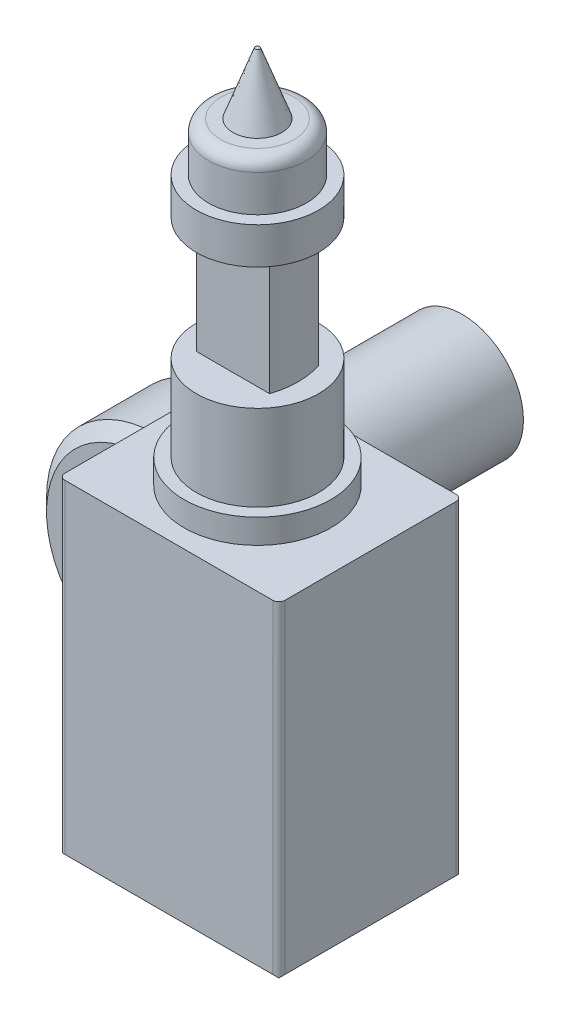
ISO-10303-21;
HEADER;
FILE_DESCRIPTION(('STEP AP214'),'2;1');
FILE_NAME('part.step','',(''),(''),'','','');
FILE_SCHEMA(('AUTOMOTIVE_DESIGN { 1 0 10303 214 1 1 1 1 }'));
ENDSEC;
DATA;
#1=APPLICATION_CONTEXT('core data for automotive mechanical design processes');
#2=APPLICATION_PROTOCOL_DEFINITION('international standard','automotive_design',2000,#1);
#3=PRODUCT_CONTEXT('',#1,'mechanical');
#4=PRODUCT('Part','Part','',(#3));
#5=PRODUCT_RELATED_PRODUCT_CATEGORY('part','',(#4));
#6=PRODUCT_DEFINITION_FORMATION('','',#4);
#7=PRODUCT_DEFINITION_CONTEXT('part definition',#1,'design');
#8=PRODUCT_DEFINITION('design','',#6,#7);
#9=PRODUCT_DEFINITION_SHAPE('','',#8);
#10=(LENGTH_UNIT() NAMED_UNIT(*) SI_UNIT(.MILLI.,.METRE.));
#11=(NAMED_UNIT(*) PLANE_ANGLE_UNIT() SI_UNIT($,.RADIAN.));
#12=(NAMED_UNIT(*) SI_UNIT($,.STERADIAN.) SOLID_ANGLE_UNIT());
#13=UNCERTAINTY_MEASURE_WITH_UNIT(LENGTH_MEASURE(1.E-05),#10,'distance_accuracy_value','');
#14=(GEOMETRIC_REPRESENTATION_CONTEXT(3) GLOBAL_UNCERTAINTY_ASSIGNED_CONTEXT((#13)) GLOBAL_UNIT_ASSIGNED_CONTEXT((#10,
#11,#12)) REPRESENTATION_CONTEXT('',''));
#15=CARTESIAN_POINT('',(0.,0.,0.));
#16=DIRECTION('',(0.,0.,1.));
#17=DIRECTION('',(1.,0.,0.));
#18=AXIS2_PLACEMENT_3D('',#15,#16,#17);
#19=CARTESIAN_POINT('',(1.4210854715202E-13,1.95399252334028E-13,-90.));
#20=DIRECTION('',(0.,0.,1.));
#21=DIRECTION('',(0.,-1.,0.));
#22=AXIS2_PLACEMENT_3D('',#19,#20,#21);
#23=PLANE('',#22);
#24=CARTESIAN_POINT('',(1.4210854715202E-13,1.95399252334028E-13,-90.));
#25=DIRECTION('',(0.,0.,-1.));
#26=DIRECTION('',(-1.,0.,0.));
#27=AXIS2_PLACEMENT_3D('',#24,#25,#26);
#28=CIRCLE('',#27,50.);
#29=CARTESIAN_POINT('',(50.,1.95399252334028E-13,-90.));
#30=VERTEX_POINT('',#29);
#31=EDGE_CURVE('E24',#30,#30,#28,.T.);
#32=ORIENTED_EDGE('',*,*,#31,.T.);
#33=EDGE_LOOP('',(#32));
#34=FACE_BOUND('',#33,.T.);
#35=ADVANCED_FACE('F15',(#34),#23,.F.);
#36=CARTESIAN_POINT('',(1.4210854715202E-13,2.1316282072803E-13,90.));
#37=DIRECTION('',(0.,0.,-1.));
#38=DIRECTION('',(-1.,0.,0.));
#39=AXIS2_PLACEMENT_3D('',#36,#37,#38);
#40=CYLINDRICAL_SURFACE('',#39,50.);
#41=ORIENTED_EDGE('',*,*,#31,.F.);
#42=DIRECTION('',(0.,0.,1.));
#43=VECTOR('',#42,1.);
#44=CARTESIAN_POINT('',(50.,2.05304863256316E-13,90.));
#45=LINE('',#44,#43);
#46=CARTESIAN_POINT('',(50.,1.95399252334028E-13,90.));
#47=VERTEX_POINT('',#46);
#48=EDGE_CURVE('E10',#30,#47,#45,.T.);
#49=ORIENTED_EDGE('',*,*,#48,.T.);
#50=CARTESIAN_POINT('',(1.4210854715202E-13,2.1316282072803E-13,90.));
#51=DIRECTION('',(0.,0.,1.));
#52=DIRECTION('',(-1.,0.,0.));
#53=AXIS2_PLACEMENT_3D('',#50,#51,#52);
#54=CIRCLE('',#53,50.);
#55=EDGE_CURVE('E383',#47,#47,#54,.T.);
#56=ORIENTED_EDGE('',*,*,#55,.F.);
#57=ORIENTED_EDGE('',*,*,#48,.F.);
#58=EDGE_LOOP('',(#41,#49,#56,#57));
#59=FACE_BOUND('',#58,.T.);
#60=ADVANCED_FACE('F562',(#59),#40,.T.);
#61=CARTESIAN_POINT('',(1.4210854715202E-13,2.1316282072803E-13,90.));
#62=DIRECTION('',(0.,0.,1.));
#63=DIRECTION('',(-1.,0.,0.));
#64=AXIS2_PLACEMENT_3D('',#61,#62,#63);
#65=CYLINDRICAL_SURFACE('',#64,90.);
#66=DIRECTION('',(0.,0.,1.));
#67=VECTOR('',#66,1.);
#68=CARTESIAN_POINT('',(1.4210854715202E-13,-90.,90.));
#69=LINE('',#68,#67);
#70=CARTESIAN_POINT('',(1.4210854715202E-13,-90.,100.));
#71=VERTEX_POINT('',#70);
#72=CARTESIAN_POINT('',(1.4210854715202E-13,-90.,160.));
#73=VERTEX_POINT('',#72);
#74=EDGE_CURVE('E390',#71,#73,#69,.T.);
#75=ORIENTED_EDGE('',*,*,#74,.T.);
#76=CARTESIAN_POINT('',(1.4210854715202E-13,2.1316282072803E-13,160.));
#77=DIRECTION('',(0.,0.,1.));
#78=DIRECTION('',(-1.,0.,0.));
#79=AXIS2_PLACEMENT_3D('',#76,#77,#78);
#80=CIRCLE('',#79,90.);
#81=CARTESIAN_POINT('',(1.4210854715202E-13,90.,160.));
#82=VERTEX_POINT('',#81);
#83=EDGE_CURVE('E315',#82,#73,#80,.T.);
#84=ORIENTED_EDGE('',*,*,#83,.F.);
#85=DIRECTION('',(0.,0.,-1.));
#86=VECTOR('',#85,1.);
#87=CARTESIAN_POINT('',(1.4210854715202E-13,90.,90.));
#88=LINE('',#87,#86);
#89=CARTESIAN_POINT('',(1.4210854715202E-13,90.,100.));
#90=VERTEX_POINT('',#89);
#91=EDGE_CURVE('E305',#82,#90,#88,.T.);
#92=ORIENTED_EDGE('',*,*,#91,.T.);
#93=CARTESIAN_POINT('',(1.4210854715202E-13,1.95399252334028E-13,100.));
#94=DIRECTION('',(0.,0.,-1.));
#95=DIRECTION('',(-1.,0.,0.));
#96=AXIS2_PLACEMENT_3D('',#93,#94,#95);
#97=CIRCLE('',#96,90.);
#98=EDGE_CURVE('E48',#71,#90,#97,.T.);
#99=ORIENTED_EDGE('',*,*,#98,.F.);
#100=EDGE_LOOP('',(#75,#84,#92,#99));
#101=FACE_BOUND('',#100,.T.);
#102=ADVANCED_FACE('F518',(#101),#65,.T.);
#103=CARTESIAN_POINT('',(1.4210854715202E-13,2.1316282072803E-13,95.));
#104=DIRECTION('',(0.,0.,1.));
#105=DIRECTION('',(-1.,0.,0.));
#106=AXIS2_PLACEMENT_3D('',#103,#104,#105);
#107=CONICAL_SURFACE('',#106,85.,0.785398163397448);
#108=DIRECTION('',(0.,-0.707106781186548,0.707106781186548));
#109=VECTOR('',#108,1.);
#110=CARTESIAN_POINT('',(1.4210854715202E-13,-85.,95.));
#111=LINE('',#110,#109);
#112=CARTESIAN_POINT('',(1.4210854715202E-13,-80.,90.));
#113=VERTEX_POINT('',#112);
#114=EDGE_CURVE('E347',#113,#71,#111,.T.);
#115=ORIENTED_EDGE('',*,*,#114,.T.);
#116=ORIENTED_EDGE('',*,*,#98,.T.);
#117=DIRECTION('',(0.,-0.707106781186548,-0.707106781186548));
#118=VECTOR('',#117,1.);
#119=CARTESIAN_POINT('',(1.4210854715202E-13,85.,95.));
#120=LINE('',#119,#118);
#121=CARTESIAN_POINT('',(1.4210854715202E-13,80.,90.));
#122=VERTEX_POINT('',#121);
#123=EDGE_CURVE('E309',#90,#122,#120,.T.);
#124=ORIENTED_EDGE('',*,*,#123,.T.);
#125=CARTESIAN_POINT('',(1.4210854715202E-13,2.1316282072803E-13,90.));
#126=DIRECTION('',(0.,0.,1.));
#127=DIRECTION('',(-1.,0.,0.));
#128=AXIS2_PLACEMENT_3D('',#125,#126,#127);
#129=CIRCLE('',#128,80.);
#130=EDGE_CURVE('E353',#122,#113,#129,.T.);
#131=ORIENTED_EDGE('',*,*,#130,.T.);
#132=EDGE_LOOP('',(#115,#116,#124,#131));
#133=FACE_BOUND('',#132,.T.);
#134=ADVANCED_FACE('F582',(#133),#107,.T.);
#135=CARTESIAN_POINT('',(1.4210854715202E-13,2.1316282072803E-13,165.));
#136=DIRECTION('',(0.,0.,-1.));
#137=DIRECTION('',(-1.,0.,0.));
#138=AXIS2_PLACEMENT_3D('',#135,#136,#137);
#139=CONICAL_SURFACE('',#138,85.,0.785398163397448);
#140=DIRECTION('',(0.,0.707106781186548,0.707106781186548));
#141=VECTOR('',#140,1.);
#142=CARTESIAN_POINT('',(1.4210854715202E-13,-85.,165.));
#143=LINE('',#142,#141);
#144=CARTESIAN_POINT('',(1.4210854715202E-13,-80.,170.));
#145=VERTEX_POINT('',#144);
#146=EDGE_CURVE('E400',#73,#145,#143,.T.);
#147=ORIENTED_EDGE('',*,*,#146,.T.);
#148=CARTESIAN_POINT('',(1.4210854715202E-13,2.1316282072803E-13,170.));
#149=DIRECTION('',(0.,0.,-1.));
#150=DIRECTION('',(-1.,0.,0.));
#151=AXIS2_PLACEMENT_3D('',#148,#149,#150);
#152=CIRCLE('',#151,80.);
#153=CARTESIAN_POINT('',(1.4210854715202E-13,80.,170.));
#154=VERTEX_POINT('',#153);
#155=EDGE_CURVE('E345',#145,#154,#152,.T.);
#156=ORIENTED_EDGE('',*,*,#155,.T.);
#157=DIRECTION('',(0.,0.707106781186548,-0.707106781186548));
#158=VECTOR('',#157,1.);
#159=CARTESIAN_POINT('',(1.4210854715202E-13,85.,165.));
#160=LINE('',#159,#158);
#161=EDGE_CURVE('E308',#154,#82,#160,.T.);
#162=ORIENTED_EDGE('',*,*,#161,.T.);
#163=ORIENTED_EDGE('',*,*,#83,.T.);
#164=EDGE_LOOP('',(#147,#156,#162,#163));
#165=FACE_BOUND('',#164,.T.);
#166=ADVANCED_FACE('F515',(#165),#139,.T.);
#167=CARTESIAN_POINT('',(1.4210854715202E-13,2.1316282072803E-13,170.));
#168=DIRECTION('',(0.,0.,1.));
#169=DIRECTION('',(0.,-1.,0.));
#170=AXIS2_PLACEMENT_3D('',#167,#168,#169);
#171=PLANE('',#170);
#172=DIRECTION('',(0.,1.,0.));
#173=VECTOR('',#172,1.);
#174=CARTESIAN_POINT('',(1.4210854715202E-13,50.,170.));
#175=LINE('',#174,#173);
#176=EDGE_CURVE('E465',#145,#154,#175,.T.);
#177=ORIENTED_EDGE('',*,*,#176,.T.);
#178=ORIENTED_EDGE('',*,*,#155,.F.);
#179=EDGE_LOOP('',(#177,#178));
#180=FACE_BOUND('',#179,.T.);
#181=ADVANCED_FACE('F507',(#180),#171,.T.);
#182=CARTESIAN_POINT('',(180.,100.,90.));
#183=DIRECTION('',(0.,1.,0.));
#184=DIRECTION('',(0.,0.,-1.));
#185=AXIS2_PLACEMENT_3D('',#182,#183,#184);
#186=PLANE('',#185);
#187=CARTESIAN_POINT('',(87.5,100.,165.));
#188=DIRECTION('',(0.,-1.,0.));
#189=DIRECTION('',(0.,0.,1.));
#190=AXIS2_PLACEMENT_3D('',#187,#188,#189);
#191=CIRCLE('',#190,60.);
#192=CARTESIAN_POINT('',(87.5,100.,105.));
#193=VERTEX_POINT('',#192);
#194=EDGE_CURVE('E284',#193,#193,#191,.T.);
#195=ORIENTED_EDGE('',*,*,#194,.T.);
#196=EDGE_LOOP('',(#195));
#197=FACE_BOUND('',#196,.T.);
#198=CARTESIAN_POINT('',(175.,100.,95.));
#199=DIRECTION('',(0.,-1.,0.));
#200=DIRECTION('',(0.707106781186548,0.,-0.707106781186548));
#201=AXIS2_PLACEMENT_3D('',#198,#199,#200);
#202=CIRCLE('',#201,5.);
#203=CARTESIAN_POINT('',(175.,100.,90.));
#204=VERTEX_POINT('',#203);
#205=CARTESIAN_POINT('',(180.,100.,95.));
#206=VERTEX_POINT('',#205);
#207=EDGE_CURVE('E271',#204,#206,#202,.T.);
#208=ORIENTED_EDGE('',*,*,#207,.F.);
#209=DIRECTION('',(-1.,0.,0.));
#210=VECTOR('',#209,1.);
#211=CARTESIAN_POINT('',(180.,100.,90.));
#212=LINE('',#211,#210);
#213=CARTESIAN_POINT('',(1.4210854715202E-13,100.,90.));
#214=VERTEX_POINT('',#213);
#215=EDGE_CURVE('E379',#204,#214,#212,.T.);
#216=ORIENTED_EDGE('',*,*,#215,.T.);
#217=DIRECTION('',(0.,0.,1.));
#218=VECTOR('',#217,1.);
#219=CARTESIAN_POINT('',(1.4210854715202E-13,100.,90.));
#220=LINE('',#219,#218);
#221=CARTESIAN_POINT('',(1.4210854715202E-13,100.,235.));
#222=VERTEX_POINT('',#221);
#223=EDGE_CURVE('E387',#214,#222,#220,.T.);
#224=ORIENTED_EDGE('',*,*,#223,.T.);
#225=CARTESIAN_POINT('',(5.00000000000014,100.,235.));
#226=DIRECTION('',(0.,-1.,0.));
#227=DIRECTION('',(-0.707106781186548,0.,0.707106781186548));
#228=AXIS2_PLACEMENT_3D('',#225,#226,#227);
#229=CIRCLE('',#228,5.);
#230=CARTESIAN_POINT('',(5.00000000000014,100.,240.));
#231=VERTEX_POINT('',#230);
#232=EDGE_CURVE('E455',#231,#222,#229,.T.);
#233=ORIENTED_EDGE('',*,*,#232,.F.);
#234=DIRECTION('',(-1.,0.,0.));
#235=VECTOR('',#234,1.);
#236=CARTESIAN_POINT('',(180.,100.,240.));
#237=LINE('',#236,#235);
#238=CARTESIAN_POINT('',(175.,100.,240.));
#239=VERTEX_POINT('',#238);
#240=EDGE_CURVE('E415',#239,#231,#237,.T.);
#241=ORIENTED_EDGE('',*,*,#240,.F.);
#242=CARTESIAN_POINT('',(175.,100.,235.));
#243=DIRECTION('',(0.,-1.,0.));
#244=DIRECTION('',(0.707106781186548,0.,0.707106781186548));
#245=AXIS2_PLACEMENT_3D('',#242,#243,#244);
#246=CIRCLE('',#245,5.);
#247=CARTESIAN_POINT('',(180.,100.,235.));
#248=VERTEX_POINT('',#247);
#249=EDGE_CURVE('E358',#248,#239,#246,.T.);
#250=ORIENTED_EDGE('',*,*,#249,.F.);
#251=DIRECTION('',(0.,0.,1.));
#252=VECTOR('',#251,1.);
#253=CARTESIAN_POINT('',(180.,100.,90.));
#254=LINE('',#253,#252);
#255=EDGE_CURVE('E384',#206,#248,#254,.T.);
#256=ORIENTED_EDGE('',*,*,#255,.F.);
#257=EDGE_LOOP('',(#208,#216,#224,#233,#241,#250,#256));
#258=FACE_BOUND('',#257,.T.);
#259=ADVANCED_FACE('F629',(#197,#258),#186,.T.);
#260=CARTESIAN_POINT('',(1.4210854715202E-13,100.,90.));
#261=DIRECTION('',(-1.,0.,0.));
#262=DIRECTION('',(0.,0.,1.));
#263=AXIS2_PLACEMENT_3D('',#260,#261,#262);
#264=PLANE('',#263);
#265=DIRECTION('',(0.,-1.,0.));
#266=VECTOR('',#265,1.);
#267=CARTESIAN_POINT('',(1.4210854715202E-13,30.,235.));
#268=LINE('',#267,#266);
#269=CARTESIAN_POINT('',(1.4210854715202E-13,-165.,235.));
#270=VERTEX_POINT('',#269);
#271=EDGE_CURVE('E471',#222,#270,#268,.T.);
#272=ORIENTED_EDGE('',*,*,#271,.F.);
#273=ORIENTED_EDGE('',*,*,#223,.F.);
#274=DIRECTION('',(0.,1.,0.));
#275=VECTOR('',#274,1.);
#276=CARTESIAN_POINT('',(1.4210854715202E-13,-180.,90.));
#277=LINE('',#276,#275);
#278=EDGE_CURVE('E357',#122,#214,#277,.T.);
#279=ORIENTED_EDGE('',*,*,#278,.F.);
#280=ORIENTED_EDGE('',*,*,#123,.F.);
#281=ORIENTED_EDGE('',*,*,#91,.F.);
#282=ORIENTED_EDGE('',*,*,#161,.F.);
#283=ORIENTED_EDGE('',*,*,#176,.F.);
#284=ORIENTED_EDGE('',*,*,#146,.F.);
#285=ORIENTED_EDGE('',*,*,#74,.F.);
#286=ORIENTED_EDGE('',*,*,#114,.F.);
#287=DIRECTION('',(0.,1.,0.));
#288=VECTOR('',#287,1.);
#289=CARTESIAN_POINT('',(1.4210854715202E-13,-180.,90.));
#290=LINE('',#289,#288);
#291=CARTESIAN_POINT('',(1.4210854715202E-13,-165.,90.));
#292=VERTEX_POINT('',#291);
#293=EDGE_CURVE('E344',#292,#113,#290,.T.);
#294=ORIENTED_EDGE('',*,*,#293,.F.);
#295=DIRECTION('',(0.,0.,-1.));
#296=VECTOR('',#295,1.);
#297=CARTESIAN_POINT('',(1.4210854715202E-13,-165.,90.));
#298=LINE('',#297,#296);
#299=EDGE_CURVE('E322',#270,#292,#298,.T.);
#300=ORIENTED_EDGE('',*,*,#299,.F.);
#301=EDGE_LOOP('',(#272,#273,#279,#280,#281,#282,#283,#284,#285,#286,#294,#300));
#302=FACE_BOUND('',#301,.T.);
#303=ADVANCED_FACE('F512',(#302),#264,.T.);
#304=CARTESIAN_POINT('',(1.4210854715202E-13,-180.,90.));
#305=DIRECTION('',(0.,-1.,0.));
#306=DIRECTION('',(-1.,0.,0.));
#307=AXIS2_PLACEMENT_3D('',#304,#305,#306);
#308=PLANE('',#307);
#309=DIRECTION('',(0.,0.,-1.));
#310=VECTOR('',#309,1.);
#311=CARTESIAN_POINT('',(165.,-180.,90.));
#312=LINE('',#311,#310);
#313=CARTESIAN_POINT('',(165.,-180.,225.));
#314=VERTEX_POINT('',#313);
#315=CARTESIAN_POINT('',(165.,-180.,105.));
#316=VERTEX_POINT('',#315);
#317=EDGE_CURVE('E361',#314,#316,#312,.T.);
#318=ORIENTED_EDGE('',*,*,#317,.F.);
#319=DIRECTION('',(1.,0.,0.));
#320=VECTOR('',#319,1.);
#321=CARTESIAN_POINT('',(45.,-180.,225.));
#322=LINE('',#321,#320);
#323=CARTESIAN_POINT('',(15.,-180.,225.));
#324=VERTEX_POINT('',#323);
#325=EDGE_CURVE('E367',#324,#314,#322,.T.);
#326=ORIENTED_EDGE('',*,*,#325,.F.);
#327=DIRECTION('',(0.,0.,1.));
#328=VECTOR('',#327,1.);
#329=CARTESIAN_POINT('',(15.,-180.,90.));
#330=LINE('',#329,#328);
#331=CARTESIAN_POINT('',(15.,-180.,105.));
#332=VERTEX_POINT('',#331);
#333=EDGE_CURVE('E325',#332,#324,#330,.T.);
#334=ORIENTED_EDGE('',*,*,#333,.F.);
#335=DIRECTION('',(-1.,0.,0.));
#336=VECTOR('',#335,1.);
#337=CARTESIAN_POINT('',(1.4210854715202E-13,-180.,105.));
#338=LINE('',#337,#336);
#339=EDGE_CURVE('E18',#316,#332,#338,.T.);
#340=ORIENTED_EDGE('',*,*,#339,.F.);
#341=EDGE_LOOP('',(#318,#326,#334,#340));
#342=FACE_BOUND('',#341,.T.);
#343=ADVANCED_FACE('F621',(#342),#308,.T.);
#344=CARTESIAN_POINT('',(180.,-180.,90.));
#345=DIRECTION('',(1.,0.,0.));
#346=DIRECTION('',(0.,-1.,0.));
#347=AXIS2_PLACEMENT_3D('',#344,#345,#346);
#348=PLANE('',#347);
#349=DIRECTION('',(0.,-1.,0.));
#350=VECTOR('',#349,1.);
#351=CARTESIAN_POINT('',(180.,-90.,95.));
#352=LINE('',#351,#350);
#353=CARTESIAN_POINT('',(180.,-165.,95.));
#354=VERTEX_POINT('',#353);
#355=EDGE_CURVE('E246',#206,#354,#352,.T.);
#356=ORIENTED_EDGE('',*,*,#355,.F.);
#357=ORIENTED_EDGE('',*,*,#255,.T.);
#358=DIRECTION('',(0.,1.,0.));
#359=VECTOR('',#358,1.);
#360=CARTESIAN_POINT('',(180.,-110.,235.));
#361=LINE('',#360,#359);
#362=CARTESIAN_POINT('',(180.,-165.,235.));
#363=VERTEX_POINT('',#362);
#364=EDGE_CURVE('E249',#363,#248,#361,.T.);
#365=ORIENTED_EDGE('',*,*,#364,.F.);
#366=DIRECTION('',(0.,0.,1.));
#367=VECTOR('',#366,1.);
#368=CARTESIAN_POINT('',(180.,-165.,90.));
#369=LINE('',#368,#367);
#370=EDGE_CURVE('E242',#354,#363,#369,.T.);
#371=ORIENTED_EDGE('',*,*,#370,.F.);
#372=EDGE_LOOP('',(#356,#357,#365,#371));
#373=FACE_BOUND('',#372,.T.);
#374=ADVANCED_FACE('F244',(#373),#348,.T.);
#375=CARTESIAN_POINT('',(7.50000000000014,-172.5,90.));
#376=DIRECTION('',(-0.707106781186548,-0.707106781186548,0.));
#377=DIRECTION('',(-0.707106781186548,0.707106781186548,0.));
#378=AXIS2_PLACEMENT_3D('',#375,#376,#377);
#379=PLANE('',#378);
#380=CARTESIAN_POINT('',(5.00000000000014,-170.,235.));
#381=DIRECTION('',(0.707106781186548,0.707106781186548,0.));
#382=DIRECTION('',(-0.707106781186548,0.707106781186548,0.));
#383=AXIS2_PLACEMENT_3D('',#380,#381,#382);
#384=ELLIPSE('',#383,7.07106781186548,5.);
#385=CARTESIAN_POINT('',(1.46446609406738,-166.464466094067,238.535533905933));
#386=VERTEX_POINT('',#385);
#387=EDGE_CURVE('E326',#270,#386,#384,.T.);
#388=ORIENTED_EDGE('',*,*,#387,.F.);
#389=ORIENTED_EDGE('',*,*,#299,.T.);
#390=DIRECTION('',(-0.577350269189626,0.577350269189626,-0.577350269189626));
#391=VECTOR('',#390,1.);
#392=CARTESIAN_POINT('',(15.,-180.,105.));
#393=LINE('',#392,#391);
#394=EDGE_CURVE('E255',#332,#292,#393,.T.);
#395=ORIENTED_EDGE('',*,*,#394,.F.);
#396=ORIENTED_EDGE('',*,*,#333,.T.);
#397=DIRECTION('',(-0.577350269189626,0.577350269189626,0.577350269189626));
#398=VECTOR('',#397,1.);
#399=CARTESIAN_POINT('',(15.,-180.,225.));
#400=LINE('',#399,#398);
#401=EDGE_CURVE('E363',#324,#386,#400,.T.);
#402=ORIENTED_EDGE('',*,*,#401,.T.);
#403=EDGE_LOOP('',(#388,#389,#395,#396,#402));
#404=FACE_BOUND('',#403,.T.);
#405=ADVANCED_FACE('F620',(#404),#379,.T.);
#406=CARTESIAN_POINT('',(5.00000000000014,30.,235.));
#407=DIRECTION('',(0.,-1.,0.));
#408=DIRECTION('',(-0.707106781186548,0.,0.707106781186548));
#409=AXIS2_PLACEMENT_3D('',#406,#407,#408);
#410=CYLINDRICAL_SURFACE('',#409,5.);
#411=CARTESIAN_POINT('',(5.00000000000014,-170.,235.));
#412=DIRECTION('',(0.,0.707106781186547,-0.707106781186548));
#413=DIRECTION('',(0.,0.707106781186548,0.707106781186547));
#414=AXIS2_PLACEMENT_3D('',#411,#412,#413);
#415=ELLIPSE('',#414,7.07106781186547,5.);
#416=CARTESIAN_POINT('',(5.00000000000014,-165.,240.));
#417=VERTEX_POINT('',#416);
#418=EDGE_CURVE('E368',#386,#417,#415,.T.);
#419=ORIENTED_EDGE('',*,*,#418,.T.);
#420=DIRECTION('',(0.,1.,0.));
#421=VECTOR('',#420,1.);
#422=CARTESIAN_POINT('',(5.00000000000014,30.,240.));
#423=LINE('',#422,#421);
#424=EDGE_CURVE('E447',#417,#231,#423,.T.);
#425=ORIENTED_EDGE('',*,*,#424,.T.);
#426=ORIENTED_EDGE('',*,*,#232,.T.);
#427=ORIENTED_EDGE('',*,*,#271,.T.);
#428=ORIENTED_EDGE('',*,*,#387,.T.);
#429=EDGE_LOOP('',(#419,#425,#426,#427,#428));
#430=FACE_BOUND('',#429,.T.);
#431=ADVANCED_FACE('F624',(#430),#410,.T.);
#432=CARTESIAN_POINT('',(90.,-40.,240.));
#433=DIRECTION('',(0.,0.,1.));
#434=DIRECTION('',(0.,-1.,0.));
#435=AXIS2_PLACEMENT_3D('',#432,#433,#434);
#436=PLANE('',#435);
#437=DIRECTION('',(0.,-1.,0.));
#438=VECTOR('',#437,1.);
#439=CARTESIAN_POINT('',(175.,-110.,240.));
#440=LINE('',#439,#438);
#441=CARTESIAN_POINT('',(175.,-165.,240.));
#442=VERTEX_POINT('',#441);
#443=EDGE_CURVE('E352',#239,#442,#440,.T.);
#444=ORIENTED_EDGE('',*,*,#443,.F.);
#445=ORIENTED_EDGE('',*,*,#240,.T.);
#446=ORIENTED_EDGE('',*,*,#424,.F.);
#447=DIRECTION('',(-1.,0.,0.));
#448=VECTOR('',#447,1.);
#449=CARTESIAN_POINT('',(45.,-165.,240.));
#450=LINE('',#449,#448);
#451=EDGE_CURVE('E297',#442,#417,#450,.T.);
#452=ORIENTED_EDGE('',*,*,#451,.F.);
#453=EDGE_LOOP('',(#444,#445,#446,#452));
#454=FACE_BOUND('',#453,.T.);
#455=ADVANCED_FACE('F611',(#454),#436,.T.);
#456=CARTESIAN_POINT('',(45.,-172.5,232.5));
#457=DIRECTION('',(0.,-0.707106781186548,0.707106781186548));
#458=DIRECTION('',(-1.,0.,0.));
#459=AXIS2_PLACEMENT_3D('',#456,#457,#458);
#460=PLANE('',#459);
#461=CARTESIAN_POINT('',(175.,-170.,235.));
#462=DIRECTION('',(0.,0.707106781186547,-0.707106781186548));
#463=DIRECTION('',(0.,0.707106781186548,0.707106781186547));
#464=AXIS2_PLACEMENT_3D('',#461,#462,#463);
#465=ELLIPSE('',#464,7.07106781186547,5.);
#466=CARTESIAN_POINT('',(178.535533905933,-166.464466094067,238.535533905933));
#467=VERTEX_POINT('',#466);
#468=EDGE_CURVE('E298',#442,#467,#465,.T.);
#469=ORIENTED_EDGE('',*,*,#468,.F.);
#470=ORIENTED_EDGE('',*,*,#451,.T.);
#471=ORIENTED_EDGE('',*,*,#418,.F.);
#472=ORIENTED_EDGE('',*,*,#401,.F.);
#473=ORIENTED_EDGE('',*,*,#325,.T.);
#474=DIRECTION('',(-0.577350269189626,-0.577350269189626,-0.577350269189626));
#475=VECTOR('',#474,1.);
#476=CARTESIAN_POINT('',(180.,-165.,240.));
#477=LINE('',#476,#475);
#478=EDGE_CURVE('E477',#467,#314,#477,.T.);
#479=ORIENTED_EDGE('',*,*,#478,.F.);
#480=EDGE_LOOP('',(#469,#470,#471,#472,#473,#479));
#481=FACE_BOUND('',#480,.T.);
#482=ADVANCED_FACE('F607',(#481),#460,.T.);
#483=CARTESIAN_POINT('',(175.,-110.,235.));
#484=DIRECTION('',(0.,1.,0.));
#485=DIRECTION('',(0.707106781186548,0.,0.707106781186548));
#486=AXIS2_PLACEMENT_3D('',#483,#484,#485);
#487=CYLINDRICAL_SURFACE('',#486,5.);
#488=ORIENTED_EDGE('',*,*,#249,.T.);
#489=ORIENTED_EDGE('',*,*,#443,.T.);
#490=ORIENTED_EDGE('',*,*,#468,.T.);
#491=CARTESIAN_POINT('',(175.,-170.,235.));
#492=DIRECTION('',(-0.707106781186548,0.707106781186548,0.));
#493=DIRECTION('',(0.707106781186548,0.707106781186548,0.));
#494=AXIS2_PLACEMENT_3D('',#491,#492,#493);
#495=ELLIPSE('',#494,7.07106781186548,5.);
#496=EDGE_CURVE('E254',#467,#363,#495,.T.);
#497=ORIENTED_EDGE('',*,*,#496,.T.);
#498=ORIENTED_EDGE('',*,*,#364,.T.);
#499=EDGE_LOOP('',(#488,#489,#490,#497,#498));
#500=FACE_BOUND('',#499,.T.);
#501=ADVANCED_FACE('F610',(#500),#487,.T.);
#502=CARTESIAN_POINT('',(172.5,-172.5,90.));
#503=DIRECTION('',(0.707106781186548,-0.707106781186548,0.));
#504=DIRECTION('',(0.,0.,-1.));
#505=AXIS2_PLACEMENT_3D('',#502,#503,#504);
#506=PLANE('',#505);
#507=CARTESIAN_POINT('',(175.,-170.,95.));
#508=DIRECTION('',(-0.707106781186548,0.707106781186548,0.));
#509=DIRECTION('',(0.707106781186548,0.707106781186548,0.));
#510=AXIS2_PLACEMENT_3D('',#507,#508,#509);
#511=ELLIPSE('',#510,7.07106781186548,5.);
#512=CARTESIAN_POINT('',(178.535533905933,-166.464466094067,91.4644660940672));
#513=VERTEX_POINT('',#512);
#514=EDGE_CURVE('E258',#354,#513,#511,.T.);
#515=ORIENTED_EDGE('',*,*,#514,.F.);
#516=ORIENTED_EDGE('',*,*,#370,.T.);
#517=ORIENTED_EDGE('',*,*,#496,.F.);
#518=ORIENTED_EDGE('',*,*,#478,.T.);
#519=ORIENTED_EDGE('',*,*,#317,.T.);
#520=DIRECTION('',(0.577350269189626,0.577350269189626,-0.577350269189626));
#521=VECTOR('',#520,1.);
#522=CARTESIAN_POINT('',(165.,-180.,105.));
#523=LINE('',#522,#521);
#524=EDGE_CURVE('E261',#316,#513,#523,.T.);
#525=ORIENTED_EDGE('',*,*,#524,.T.);
#526=EDGE_LOOP('',(#515,#516,#517,#518,#519,#525));
#527=FACE_BOUND('',#526,.T.);
#528=ADVANCED_FACE('F259',(#527),#506,.T.);
#529=CARTESIAN_POINT('',(1.4210854715202E-13,-172.5,97.5));
#530=DIRECTION('',(0.,-0.707106781186548,-0.707106781186548));
#531=DIRECTION('',(0.,-0.707106781186548,0.707106781186548));
#532=AXIS2_PLACEMENT_3D('',#529,#530,#531);
#533=PLANE('',#532);
#534=CARTESIAN_POINT('',(175.,-170.,95.));
#535=DIRECTION('',(0.,0.707106781186548,0.707106781186547));
#536=DIRECTION('',(0.,0.707106781186547,-0.707106781186548));
#537=AXIS2_PLACEMENT_3D('',#534,#535,#536);
#538=ELLIPSE('',#537,7.07106781186547,5.);
#539=CARTESIAN_POINT('',(175.,-165.,90.));
#540=VERTEX_POINT('',#539);
#541=EDGE_CURVE('E287',#513,#540,#538,.T.);
#542=ORIENTED_EDGE('',*,*,#541,.F.);
#543=ORIENTED_EDGE('',*,*,#524,.F.);
#544=ORIENTED_EDGE('',*,*,#339,.T.);
#545=ORIENTED_EDGE('',*,*,#394,.T.);
#546=DIRECTION('',(1.,0.,0.));
#547=VECTOR('',#546,1.);
#548=CARTESIAN_POINT('',(1.4210854715202E-13,-165.,90.));
#549=LINE('',#548,#547);
#550=EDGE_CURVE('E266',#292,#540,#549,.T.);
#551=ORIENTED_EDGE('',*,*,#550,.T.);
#552=EDGE_LOOP('',(#542,#543,#544,#545,#551));
#553=FACE_BOUND('',#552,.T.);
#554=ADVANCED_FACE('F572',(#553),#533,.T.);
#555=CARTESIAN_POINT('',(1.4210854715202E-13,2.1316282072803E-13,90.));
#556=DIRECTION('',(0.,0.,1.));
#557=DIRECTION('',(0.,-1.,0.));
#558=AXIS2_PLACEMENT_3D('',#555,#556,#557);
#559=PLANE('',#558);
#560=ORIENTED_EDGE('',*,*,#55,.T.);
#561=EDGE_LOOP('',(#560));
#562=FACE_BOUND('',#561,.T.);
#563=DIRECTION('',(0.,1.,0.));
#564=VECTOR('',#563,1.);
#565=CARTESIAN_POINT('',(175.,-90.,90.));
#566=LINE('',#565,#564);
#567=EDGE_CURVE('E278',#540,#204,#566,.T.);
#568=ORIENTED_EDGE('',*,*,#567,.F.);
#569=ORIENTED_EDGE('',*,*,#550,.F.);
#570=ORIENTED_EDGE('',*,*,#293,.T.);
#571=ORIENTED_EDGE('',*,*,#130,.F.);
#572=ORIENTED_EDGE('',*,*,#278,.T.);
#573=ORIENTED_EDGE('',*,*,#215,.F.);
#574=EDGE_LOOP('',(#568,#569,#570,#571,#572,#573));
#575=FACE_BOUND('',#574,.T.);
#576=ADVANCED_FACE('F569',(#562,#575),#559,.F.);
#577=CARTESIAN_POINT('',(175.,-90.,95.));
#578=DIRECTION('',(0.,-1.,0.));
#579=DIRECTION('',(0.707106781186548,0.,-0.707106781186548));
#580=AXIS2_PLACEMENT_3D('',#577,#578,#579);
#581=CYLINDRICAL_SURFACE('',#580,5.);
#582=ORIENTED_EDGE('',*,*,#541,.T.);
#583=ORIENTED_EDGE('',*,*,#567,.T.);
#584=ORIENTED_EDGE('',*,*,#207,.T.);
#585=ORIENTED_EDGE('',*,*,#355,.T.);
#586=ORIENTED_EDGE('',*,*,#514,.T.);
#587=EDGE_LOOP('',(#582,#583,#584,#585,#586));
#588=FACE_BOUND('',#587,.T.);
#589=ADVANCED_FACE('F268',(#588),#581,.T.);
#590=CARTESIAN_POINT('',(87.5,120.,165.));
#591=DIRECTION('',(0.,1.,0.));
#592=DIRECTION('',(0.,0.,-1.));
#593=AXIS2_PLACEMENT_3D('',#590,#591,#592);
#594=PLANE('',#593);
#595=CARTESIAN_POINT('',(87.5,120.,165.));
#596=DIRECTION('',(0.,-1.,0.));
#597=DIRECTION('',(0.,0.,1.));
#598=AXIS2_PLACEMENT_3D('',#595,#596,#597);
#599=CIRCLE('',#598,50.);
#600=CARTESIAN_POINT('',(87.5,120.,115.));
#601=VERTEX_POINT('',#600);
#602=EDGE_CURVE('E320',#601,#601,#599,.T.);
#603=ORIENTED_EDGE('',*,*,#602,.T.);
#604=EDGE_LOOP('',(#603));
#605=FACE_BOUND('',#604,.T.);
#606=CARTESIAN_POINT('',(87.5,120.,165.));
#607=DIRECTION('',(0.,1.,0.));
#608=DIRECTION('',(0.,0.,1.));
#609=AXIS2_PLACEMENT_3D('',#606,#607,#608);
#610=CIRCLE('',#609,60.);
#611=CARTESIAN_POINT('',(87.5,120.,105.));
#612=VERTEX_POINT('',#611);
#613=EDGE_CURVE('E332',#612,#612,#610,.T.);
#614=ORIENTED_EDGE('',*,*,#613,.T.);
#615=EDGE_LOOP('',(#614));
#616=FACE_BOUND('',#615,.T.);
#617=ADVANCED_FACE('F600',(#605,#616),#594,.T.);
#618=CARTESIAN_POINT('',(87.5,100.,165.));
#619=DIRECTION('',(0.,1.,0.));
#620=DIRECTION('',(0.,0.,1.));
#621=AXIS2_PLACEMENT_3D('',#618,#619,#620);
#622=CYLINDRICAL_SURFACE('',#621,60.);
#623=ORIENTED_EDGE('',*,*,#613,.F.);
#624=DIRECTION('',(0.,-1.,0.));
#625=VECTOR('',#624,1.);
#626=CARTESIAN_POINT('',(87.5,100.,105.));
#627=LINE('',#626,#625);
#628=EDGE_CURVE('E288',#612,#193,#627,.T.);
#629=ORIENTED_EDGE('',*,*,#628,.T.);
#630=ORIENTED_EDGE('',*,*,#194,.F.);
#631=ORIENTED_EDGE('',*,*,#628,.F.);
#632=EDGE_LOOP('',(#623,#629,#630,#631));
#633=FACE_BOUND('',#632,.T.);
#634=ADVANCED_FACE('F603',(#633),#622,.T.);
#635=CARTESIAN_POINT('',(87.5,190.,165.));
#636=DIRECTION('',(0.,1.,0.));
#637=DIRECTION('',(0.,0.,-1.));
#638=AXIS2_PLACEMENT_3D('',#635,#636,#637);
#639=PLANE('',#638);
#640=DIRECTION('',(1.,0.,0.));
#641=VECTOR('',#640,1.);
#642=CARTESIAN_POINT('',(102.5,190.,145.));
#643=LINE('',#642,#641);
#644=CARTESIAN_POINT('',(57.5,190.,145.));
#645=VERTEX_POINT('',#644);
#646=CARTESIAN_POINT('',(117.5,190.,145.));
#647=VERTEX_POINT('',#646);
#648=EDGE_CURVE('E416',#645,#647,#643,.T.);
#649=ORIENTED_EDGE('',*,*,#648,.T.);
#650=CARTESIAN_POINT('',(55.938741982382,190.,165.));
#651=DIRECTION('',(0.,-1.,0.));
#652=DIRECTION('',(0.,0.,1.));
#653=AXIS2_PLACEMENT_3D('',#650,#651,#652);
#654=CIRCLE('',#653,64.7285755189449);
#655=CARTESIAN_POINT('',(117.5,190.,185.));
#656=VERTEX_POINT('',#655);
#657=EDGE_CURVE('E373',#647,#656,#654,.T.);
#658=ORIENTED_EDGE('',*,*,#657,.T.);
#659=DIRECTION('',(-1.,0.,0.));
#660=VECTOR('',#659,1.);
#661=CARTESIAN_POINT('',(87.5,190.,185.));
#662=LINE('',#661,#660);
#663=CARTESIAN_POINT('',(57.5,190.,185.));
#664=VERTEX_POINT('',#663);
#665=EDGE_CURVE('E429',#656,#664,#662,.T.);
#666=ORIENTED_EDGE('',*,*,#665,.T.);
#667=CARTESIAN_POINT('',(119.061258017618,190.,165.));
#668=DIRECTION('',(0.,-1.,0.));
#669=DIRECTION('',(0.,0.,1.));
#670=AXIS2_PLACEMENT_3D('',#667,#668,#669);
#671=CIRCLE('',#670,64.7285755189449);
#672=EDGE_CURVE('E531',#664,#645,#671,.T.);
#673=ORIENTED_EDGE('',*,*,#672,.T.);
#674=EDGE_LOOP('',(#649,#658,#666,#673));
#675=FACE_BOUND('',#674,.T.);
#676=CARTESIAN_POINT('',(87.5,190.,165.));
#677=DIRECTION('',(0.,1.,0.));
#678=DIRECTION('',(0.,0.,1.));
#679=AXIS2_PLACEMENT_3D('',#676,#677,#678);
#680=CIRCLE('',#679,50.);
#681=CARTESIAN_POINT('',(87.5,190.,115.));
#682=VERTEX_POINT('',#681);
#683=EDGE_CURVE('E321',#682,#682,#680,.T.);
#684=ORIENTED_EDGE('',*,*,#683,.T.);
#685=EDGE_LOOP('',(#684));
#686=FACE_BOUND('',#685,.T.);
#687=ADVANCED_FACE('F593',(#675,#686),#639,.T.);
#688=CARTESIAN_POINT('',(87.5,120.,165.));
#689=DIRECTION('',(0.,1.,0.));
#690=DIRECTION('',(0.,0.,1.));
#691=AXIS2_PLACEMENT_3D('',#688,#689,#690);
#692=CYLINDRICAL_SURFACE('',#691,50.);
#693=ORIENTED_EDGE('',*,*,#683,.F.);
#694=DIRECTION('',(0.,-1.,0.));
#695=VECTOR('',#694,1.);
#696=CARTESIAN_POINT('',(87.5,120.,115.));
#697=LINE('',#696,#695);
#698=EDGE_CURVE('E316',#682,#601,#697,.T.);
#699=ORIENTED_EDGE('',*,*,#698,.T.);
#700=ORIENTED_EDGE('',*,*,#602,.F.);
#701=ORIENTED_EDGE('',*,*,#698,.F.);
#702=EDGE_LOOP('',(#693,#699,#700,#701));
#703=FACE_BOUND('',#702,.T.);
#704=ADVANCED_FACE('F641',(#703),#692,.T.);
#705=CARTESIAN_POINT('',(87.5,190.,185.));
#706=DIRECTION('',(0.,0.,1.));
#707=DIRECTION('',(0.,-1.,0.));
#708=AXIS2_PLACEMENT_3D('',#705,#706,#707);
#709=PLANE('',#708);
#710=ORIENTED_EDGE('',*,*,#665,.F.);
#711=DIRECTION('',(0.,1.,0.));
#712=VECTOR('',#711,1.);
#713=CARTESIAN_POINT('',(117.5,190.,185.));
#714=LINE('',#713,#712);
#715=CARTESIAN_POINT('',(117.5,290.,185.));
#716=VERTEX_POINT('',#715);
#717=EDGE_CURVE('E377',#656,#716,#714,.T.);
#718=ORIENTED_EDGE('',*,*,#717,.T.);
#719=DIRECTION('',(-1.,0.,0.));
#720=VECTOR('',#719,1.);
#721=CARTESIAN_POINT('',(57.5,290.,185.));
#722=LINE('',#721,#720);
#723=CARTESIAN_POINT('',(57.5,290.,185.));
#724=VERTEX_POINT('',#723);
#725=EDGE_CURVE('E303',#716,#724,#722,.T.);
#726=ORIENTED_EDGE('',*,*,#725,.T.);
#727=DIRECTION('',(0.,1.,0.));
#728=VECTOR('',#727,1.);
#729=CARTESIAN_POINT('',(57.5,190.,185.));
#730=LINE('',#729,#728);
#731=EDGE_CURVE('E474',#664,#724,#730,.T.);
#732=ORIENTED_EDGE('',*,*,#731,.F.);
#733=EDGE_LOOP('',(#710,#718,#726,#732));
#734=FACE_BOUND('',#733,.T.);
#735=ADVANCED_FACE('F637',(#734),#709,.T.);
#736=CARTESIAN_POINT('',(55.938741982382,190.,165.));
#737=DIRECTION('',(0.,1.,0.));
#738=DIRECTION('',(0.,0.,1.));
#739=AXIS2_PLACEMENT_3D('',#736,#737,#738);
#740=CYLINDRICAL_SURFACE('',#739,64.7285755189449);
#741=ORIENTED_EDGE('',*,*,#657,.F.);
#742=DIRECTION('',(0.,1.,0.));
#743=VECTOR('',#742,1.);
#744=CARTESIAN_POINT('',(117.5,190.,145.));
#745=LINE('',#744,#743);
#746=CARTESIAN_POINT('',(117.5,290.,145.));
#747=VERTEX_POINT('',#746);
#748=EDGE_CURVE('E378',#647,#747,#745,.T.);
#749=ORIENTED_EDGE('',*,*,#748,.T.);
#750=CARTESIAN_POINT('',(55.938741982382,290.,165.));
#751=DIRECTION('',(0.,1.,0.));
#752=DIRECTION('',(0.,0.,1.));
#753=AXIS2_PLACEMENT_3D('',#750,#751,#752);
#754=CIRCLE('',#753,64.7285755189449);
#755=EDGE_CURVE('E372',#716,#747,#754,.T.);
#756=ORIENTED_EDGE('',*,*,#755,.F.);
#757=ORIENTED_EDGE('',*,*,#717,.F.);
#758=EDGE_LOOP('',(#741,#749,#756,#757));
#759=FACE_BOUND('',#758,.T.);
#760=ADVANCED_FACE('F640',(#759),#740,.T.);
#761=CARTESIAN_POINT('',(117.5,190.,145.));
#762=DIRECTION('',(0.,0.,-1.));
#763=DIRECTION('',(0.,-1.,0.));
#764=AXIS2_PLACEMENT_3D('',#761,#762,#763);
#765=PLANE('',#764);
#766=ORIENTED_EDGE('',*,*,#648,.F.);
#767=DIRECTION('',(0.,1.,0.));
#768=VECTOR('',#767,1.);
#769=CARTESIAN_POINT('',(57.5,190.,145.));
#770=LINE('',#769,#768);
#771=CARTESIAN_POINT('',(57.5,290.,145.));
#772=VERTEX_POINT('',#771);
#773=EDGE_CURVE('E420',#645,#772,#770,.T.);
#774=ORIENTED_EDGE('',*,*,#773,.T.);
#775=DIRECTION('',(-1.,0.,0.));
#776=VECTOR('',#775,1.);
#777=CARTESIAN_POINT('',(57.5,290.,145.));
#778=LINE('',#777,#776);
#779=EDGE_CURVE('E341',#747,#772,#778,.T.);
#780=ORIENTED_EDGE('',*,*,#779,.F.);
#781=ORIENTED_EDGE('',*,*,#748,.F.);
#782=EDGE_LOOP('',(#766,#774,#780,#781));
#783=FACE_BOUND('',#782,.T.);
#784=ADVANCED_FACE('F857',(#783),#765,.T.);
#785=CARTESIAN_POINT('',(119.061258017618,190.,165.));
#786=DIRECTION('',(0.,-1.,0.));
#787=DIRECTION('',(0.,0.,1.));
#788=AXIS2_PLACEMENT_3D('',#785,#786,#787);
#789=CYLINDRICAL_SURFACE('',#788,64.7285755189449);
#790=ORIENTED_EDGE('',*,*,#672,.F.);
#791=ORIENTED_EDGE('',*,*,#731,.T.);
#792=CARTESIAN_POINT('',(119.061258017618,290.,165.));
#793=DIRECTION('',(0.,-1.,0.));
#794=DIRECTION('',(0.,0.,1.));
#795=AXIS2_PLACEMENT_3D('',#792,#793,#794);
#796=CIRCLE('',#795,64.7285755189449);
#797=EDGE_CURVE('E299',#724,#772,#796,.T.);
#798=ORIENTED_EDGE('',*,*,#797,.T.);
#799=ORIENTED_EDGE('',*,*,#773,.F.);
#800=EDGE_LOOP('',(#790,#791,#798,#799));
#801=FACE_BOUND('',#800,.T.);
#802=ADVANCED_FACE('F598',(#801),#789,.T.);
#803=CARTESIAN_POINT('',(87.5,320.,165.));
#804=DIRECTION('',(0.,1.,0.));
#805=DIRECTION('',(0.,0.,-1.));
#806=AXIS2_PLACEMENT_3D('',#803,#804,#805);
#807=PLANE('',#806);
#808=CARTESIAN_POINT('',(87.5,320.,165.));
#809=DIRECTION('',(0.,-1.,0.));
#810=DIRECTION('',(0.,0.,1.));
#811=AXIS2_PLACEMENT_3D('',#808,#809,#810);
#812=CIRCLE('',#811,40.);
#813=CARTESIAN_POINT('',(87.5,320.,125.));
#814=VERTEX_POINT('',#813);
#815=EDGE_CURVE('E293',#814,#814,#812,.T.);
#816=ORIENTED_EDGE('',*,*,#815,.T.);
#817=EDGE_LOOP('',(#816));
#818=FACE_BOUND('',#817,.T.);
#819=CARTESIAN_POINT('',(87.5,320.,165.));
#820=DIRECTION('',(0.,1.,0.));
#821=DIRECTION('',(0.,0.,1.));
#822=AXIS2_PLACEMENT_3D('',#819,#820,#821);
#823=CIRCLE('',#822,50.);
#824=CARTESIAN_POINT('',(87.5,320.,115.));
#825=VERTEX_POINT('',#824);
#826=EDGE_CURVE('E336',#825,#825,#823,.T.);
#827=ORIENTED_EDGE('',*,*,#826,.T.);
#828=EDGE_LOOP('',(#827));
#829=FACE_BOUND('',#828,.T.);
#830=ADVANCED_FACE('F595',(#818,#829),#807,.T.);
#831=CARTESIAN_POINT('',(87.5,290.,165.));
#832=DIRECTION('',(0.,1.,0.));
#833=DIRECTION('',(0.,0.,1.));
#834=AXIS2_PLACEMENT_3D('',#831,#832,#833);
#835=CYLINDRICAL_SURFACE('',#834,50.);
#836=ORIENTED_EDGE('',*,*,#826,.F.);
#837=DIRECTION('',(0.,-1.,0.));
#838=VECTOR('',#837,1.);
#839=CARTESIAN_POINT('',(87.5,290.,115.));
#840=LINE('',#839,#838);
#841=CARTESIAN_POINT('',(87.5,290.,115.));
#842=VERTEX_POINT('',#841);
#843=EDGE_CURVE('E340',#825,#842,#840,.T.);
#844=ORIENTED_EDGE('',*,*,#843,.T.);
#845=CARTESIAN_POINT('',(87.5,290.,165.));
#846=DIRECTION('',(0.,1.,0.));
#847=DIRECTION('',(0.,0.,1.));
#848=AXIS2_PLACEMENT_3D('',#845,#846,#847);
#849=CIRCLE('',#848,50.);
#850=EDGE_CURVE('E304',#842,#842,#849,.T.);
#851=ORIENTED_EDGE('',*,*,#850,.T.);
#852=ORIENTED_EDGE('',*,*,#843,.F.);
#853=EDGE_LOOP('',(#836,#844,#851,#852));
#854=FACE_BOUND('',#853,.T.);
#855=ADVANCED_FACE('F558',(#854),#835,.T.);
#856=CARTESIAN_POINT('',(87.5,290.,165.));
#857=DIRECTION('',(0.,1.,0.));
#858=DIRECTION('',(0.,0.,-1.));
#859=AXIS2_PLACEMENT_3D('',#856,#857,#858);
#860=PLANE('',#859);
#861=ORIENTED_EDGE('',*,*,#797,.F.);
#862=ORIENTED_EDGE('',*,*,#725,.F.);
#863=ORIENTED_EDGE('',*,*,#755,.T.);
#864=ORIENTED_EDGE('',*,*,#779,.T.);
#865=EDGE_LOOP('',(#861,#862,#863,#864));
#866=FACE_BOUND('',#865,.T.);
#867=ORIENTED_EDGE('',*,*,#850,.F.);
#868=EDGE_LOOP('',(#867));
#869=FACE_BOUND('',#868,.T.);
#870=ADVANCED_FACE('F549',(#866,#869),#860,.F.);
#871=CARTESIAN_POINT('',(87.5,360.,165.));
#872=DIRECTION('',(0.,1.,0.));
#873=DIRECTION('',(0.,0.,-1.));
#874=AXIS2_PLACEMENT_3D('',#871,#872,#873);
#875=PLANE('',#874);
#876=CARTESIAN_POINT('',(87.5,360.,165.));
#877=DIRECTION('',(0.,-1.,0.));
#878=DIRECTION('',(0.,0.,1.));
#879=AXIS2_PLACEMENT_3D('',#876,#877,#878);
#880=CIRCLE('',#879,20.);
#881=CARTESIAN_POINT('',(87.5,360.,145.));
#882=VERTEX_POINT('',#881);
#883=EDGE_CURVE('E459',#882,#882,#880,.T.);
#884=ORIENTED_EDGE('',*,*,#883,.T.);
#885=EDGE_LOOP('',(#884));
#886=FACE_BOUND('',#885,.T.);
#887=CARTESIAN_POINT('',(87.5,360.,165.));
#888=DIRECTION('',(0.,-1.,0.));
#889=DIRECTION('',(0.,0.,1.));
#890=AXIS2_PLACEMENT_3D('',#887,#888,#889);
#891=CIRCLE('',#890,30.);
#892=CARTESIAN_POINT('',(87.5,360.,195.));
#893=VERTEX_POINT('',#892);
#894=EDGE_CURVE('E405',#893,#893,#891,.T.);
#895=ORIENTED_EDGE('',*,*,#894,.F.);
#896=EDGE_LOOP('',(#895));
#897=FACE_BOUND('',#896,.T.);
#898=ADVANCED_FACE('F547',(#886,#897),#875,.T.);
#899=CARTESIAN_POINT('',(87.5,320.,165.));
#900=DIRECTION('',(0.,1.,0.));
#901=DIRECTION('',(0.,0.,1.));
#902=AXIS2_PLACEMENT_3D('',#899,#900,#901);
#903=CYLINDRICAL_SURFACE('',#902,40.);
#904=CARTESIAN_POINT('',(87.5,350.,165.));
#905=DIRECTION('',(0.,1.,0.));
#906=DIRECTION('',(0.,0.,1.));
#907=AXIS2_PLACEMENT_3D('',#904,#905,#906);
#908=CIRCLE('',#907,40.);
#909=CARTESIAN_POINT('',(87.5,350.,125.));
#910=VERTEX_POINT('',#909);
#911=CARTESIAN_POINT('',(87.5,350.,205.));
#912=VERTEX_POINT('',#911);
#913=EDGE_CURVE('E294',#910,#912,#908,.T.);
#914=ORIENTED_EDGE('',*,*,#913,.F.);
#915=DIRECTION('',(0.,-1.,0.));
#916=VECTOR('',#915,1.);
#917=CARTESIAN_POINT('',(87.5,320.,125.));
#918=LINE('',#917,#916);
#919=EDGE_CURVE('E289',#910,#814,#918,.T.);
#920=ORIENTED_EDGE('',*,*,#919,.T.);
#921=ORIENTED_EDGE('',*,*,#815,.F.);
#922=ORIENTED_EDGE('',*,*,#919,.F.);
#923=CARTESIAN_POINT('',(87.5,350.,165.));
#924=DIRECTION('',(0.,1.,0.));
#925=DIRECTION('',(0.,0.,1.));
#926=AXIS2_PLACEMENT_3D('',#923,#924,#925);
#927=CIRCLE('',#926,40.);
#928=EDGE_CURVE('E327',#912,#910,#927,.T.);
#929=ORIENTED_EDGE('',*,*,#928,.F.);
#930=EDGE_LOOP('',(#914,#920,#921,#922,#929));
#931=FACE_BOUND('',#930,.T.);
#932=ADVANCED_FACE('F543',(#931),#903,.T.);
#933=CARTESIAN_POINT('',(87.5,350.,165.));
#934=DIRECTION('',(0.,1.,0.));
#935=DIRECTION('',(0.,0.,-1.));
#936=AXIS2_PLACEMENT_3D('',#933,#934,#935);
#937=TOROIDAL_SURFACE('',#936,30.,10.);
#938=ORIENTED_EDGE('',*,*,#894,.T.);
#939=CARTESIAN_POINT('',(87.5,350.,195.));
#940=DIRECTION('',(1.,0.,0.));
#941=DIRECTION('',(0.,0.,1.));
#942=AXIS2_PLACEMENT_3D('',#939,#940,#941);
#943=CIRCLE('',#942,10.);
#944=EDGE_CURVE('E331',#893,#912,#943,.T.);
#945=ORIENTED_EDGE('',*,*,#944,.T.);
#946=ORIENTED_EDGE('',*,*,#928,.T.);
#947=ORIENTED_EDGE('',*,*,#913,.T.);
#948=ORIENTED_EDGE('',*,*,#944,.F.);
#949=EDGE_LOOP('',(#938,#945,#946,#947,#948));
#950=FACE_BOUND('',#949,.T.);
#951=ADVANCED_FACE('F541',(#950),#937,.T.);
#952=CARTESIAN_POINT('',(87.5,410.,165.));
#953=DIRECTION('',(0.,1.,0.));
#954=DIRECTION('',(0.,0.,-1.));
#955=AXIS2_PLACEMENT_3D('',#952,#953,#954);
#956=PLANE('',#955);
#957=CARTESIAN_POINT('',(87.5,410.,165.));
#958=DIRECTION('',(0.,-1.,0.));
#959=DIRECTION('',(0.,0.,1.));
#960=AXIS2_PLACEMENT_3D('',#957,#958,#959);
#961=CIRCLE('',#960,1.80148828668988);
#962=CARTESIAN_POINT('',(87.5,410.,163.19851171331));
#963=VERTEX_POINT('',#962);
#964=EDGE_CURVE('E482',#963,#963,#961,.T.);
#965=ORIENTED_EDGE('',*,*,#964,.F.);
#966=EDGE_LOOP('',(#965));
#967=FACE_BOUND('',#966,.T.);
#968=ADVANCED_FACE('F614',(#967),#956,.T.);
#969=CARTESIAN_POINT('',(87.5,360.,165.));
#970=DIRECTION('',(0.,-1.,0.));
#971=DIRECTION('',(0.,0.,1.));
#972=AXIS2_PLACEMENT_3D('',#969,#970,#971);
#973=CONICAL_SURFACE('',#972,20.,0.349065850398866);
#974=ORIENTED_EDGE('',*,*,#964,.T.);
#975=DIRECTION('',(0.,-0.939692620785908,-0.342020143325669));
#976=VECTOR('',#975,1.);
#977=CARTESIAN_POINT('',(87.5,360.,145.));
#978=LINE('',#977,#976);
#979=EDGE_CURVE('E478',#963,#882,#978,.T.);
#980=ORIENTED_EDGE('',*,*,#979,.T.);
#981=ORIENTED_EDGE('',*,*,#883,.F.);
#982=ORIENTED_EDGE('',*,*,#979,.F.);
#983=EDGE_LOOP('',(#974,#980,#981,#982));
#984=FACE_BOUND('',#983,.T.);
#985=ADVANCED_FACE('F633',(#984),#973,.T.);
#986=CLOSED_SHELL('',(#35,#60,#102,#134,#166,#181,#259,#303,#343,#374,#405,#431,#455,#482,#501,
#528,#554,#576,#589,#617,#634,#687,#704,#735,#760,#784,#802,#830,#855,#870,#898,#932,#951,#968,#985));
#987=MANIFOLD_SOLID_BREP('B1',#986);
#988=ADVANCED_BREP_SHAPE_REPRESENTATION('',(#18,#987),#14);
#989=SHAPE_DEFINITION_REPRESENTATION(#9,#988);
ENDSEC;
END-ISO-10303-21;
